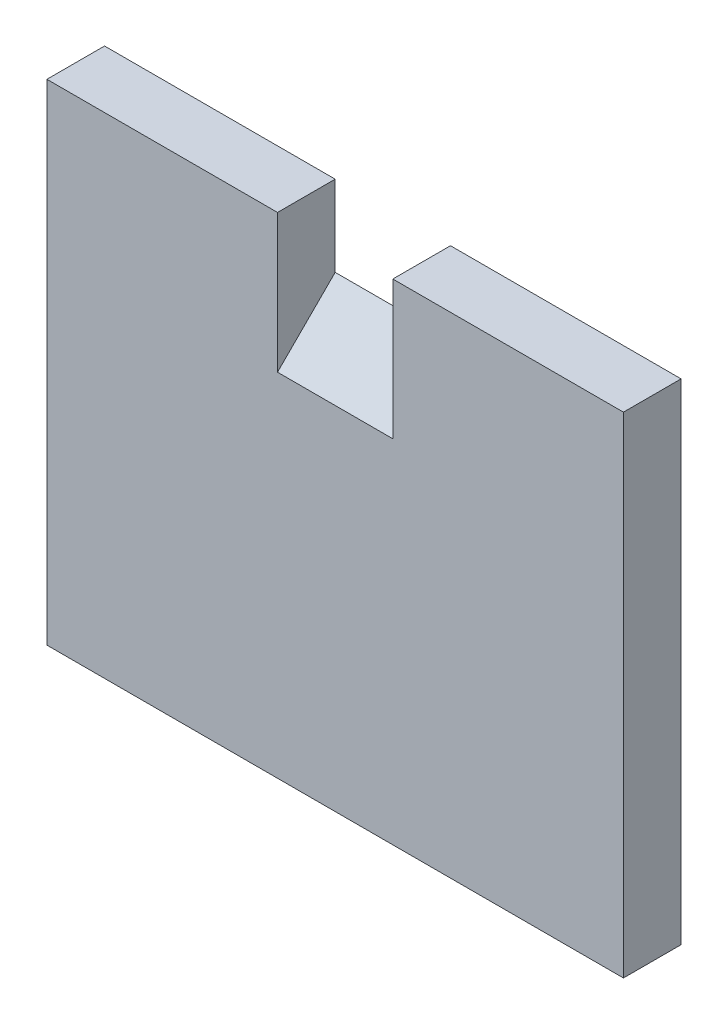
ISO-10303-21;
HEADER;
FILE_DESCRIPTION(('STEP AP214'),'2;1');
FILE_NAME('part.step','',(''),(''),'','','');
FILE_SCHEMA(('AUTOMOTIVE_DESIGN { 1 0 10303 214 1 1 1 1 }'));
ENDSEC;
DATA;
#1=APPLICATION_CONTEXT('core data for automotive mechanical design processes');
#2=APPLICATION_PROTOCOL_DEFINITION('international standard','automotive_design',2000,#1);
#3=PRODUCT_CONTEXT('',#1,'mechanical');
#4=PRODUCT('Part','Part','',(#3));
#5=PRODUCT_RELATED_PRODUCT_CATEGORY('part','',(#4));
#6=PRODUCT_DEFINITION_FORMATION('','',#4);
#7=PRODUCT_DEFINITION_CONTEXT('part definition',#1,'design');
#8=PRODUCT_DEFINITION('design','',#6,#7);
#9=PRODUCT_DEFINITION_SHAPE('','',#8);
#10=(LENGTH_UNIT() NAMED_UNIT(*) SI_UNIT(.MILLI.,.METRE.));
#11=(NAMED_UNIT(*) PLANE_ANGLE_UNIT() SI_UNIT($,.RADIAN.));
#12=(NAMED_UNIT(*) SI_UNIT($,.STERADIAN.) SOLID_ANGLE_UNIT());
#13=UNCERTAINTY_MEASURE_WITH_UNIT(LENGTH_MEASURE(1.E-05),#10,'distance_accuracy_value','');
#14=(GEOMETRIC_REPRESENTATION_CONTEXT(3) GLOBAL_UNCERTAINTY_ASSIGNED_CONTEXT((#13)) GLOBAL_UNIT_ASSIGNED_CONTEXT((#10,
#11,#12)) REPRESENTATION_CONTEXT('',''));
#15=CARTESIAN_POINT('',(0.,0.,0.));
#16=DIRECTION('',(0.,0.,1.));
#17=DIRECTION('',(1.,0.,0.));
#18=AXIS2_PLACEMENT_3D('',#15,#16,#17);
#19=CARTESIAN_POINT('',(-50.,-42.5,10.));
#20=DIRECTION('',(-1.,0.,0.));
#21=DIRECTION('',(0.,0.,1.));
#22=AXIS2_PLACEMENT_3D('',#19,#20,#21);
#23=PLANE('',#22);
#24=DIRECTION('',(0.,1.,0.));
#25=VECTOR('',#24,1.);
#26=CARTESIAN_POINT('',(-50.,-42.5,0.));
#27=LINE('',#26,#25);
#28=CARTESIAN_POINT('',(-50.,-42.5,0.));
#29=VERTEX_POINT('',#28);
#30=CARTESIAN_POINT('',(-50.,42.5,0.));
#31=VERTEX_POINT('',#30);
#32=EDGE_CURVE('E149',#29,#31,#27,.T.);
#33=ORIENTED_EDGE('',*,*,#32,.F.);
#34=DIRECTION('',(0.,0.,-1.));
#35=VECTOR('',#34,1.);
#36=CARTESIAN_POINT('',(-50.,-42.5,10.));
#37=LINE('',#36,#35);
#38=CARTESIAN_POINT('',(-50.,-42.5,10.));
#39=VERTEX_POINT('',#38);
#40=EDGE_CURVE('E147',#39,#29,#37,.T.);
#41=ORIENTED_EDGE('',*,*,#40,.F.);
#42=DIRECTION('',(0.,1.,0.));
#43=VECTOR('',#42,1.);
#44=CARTESIAN_POINT('',(-50.,-42.5,10.));
#45=LINE('',#44,#43);
#46=CARTESIAN_POINT('',(-50.,42.5,10.));
#47=VERTEX_POINT('',#46);
#48=EDGE_CURVE('E143',#39,#47,#45,.T.);
#49=ORIENTED_EDGE('',*,*,#48,.T.);
#50=DIRECTION('',(0.,0.,-1.));
#51=VECTOR('',#50,1.);
#52=CARTESIAN_POINT('',(-50.,42.5,10.));
#53=LINE('',#52,#51);
#54=EDGE_CURVE('E140',#47,#31,#53,.T.);
#55=ORIENTED_EDGE('',*,*,#54,.T.);
#56=EDGE_LOOP('',(#33,#41,#49,#55));
#57=FACE_BOUND('',#56,.T.);
#58=ADVANCED_FACE('F35',(#57),#23,.T.);
#59=CARTESIAN_POINT('',(-50.,-42.5,10.));
#60=DIRECTION('',(0.,1.,0.));
#61=DIRECTION('',(0.,0.,1.));
#62=AXIS2_PLACEMENT_3D('',#59,#60,#61);
#63=PLANE('',#62);
#64=DIRECTION('',(1.,0.,0.));
#65=VECTOR('',#64,1.);
#66=CARTESIAN_POINT('',(-50.,-42.5,0.));
#67=LINE('',#66,#65);
#68=CARTESIAN_POINT('',(50.,-42.5,0.));
#69=VERTEX_POINT('',#68);
#70=EDGE_CURVE('E142',#29,#69,#67,.T.);
#71=ORIENTED_EDGE('',*,*,#70,.T.);
#72=DIRECTION('',(0.,0.,-1.));
#73=VECTOR('',#72,1.);
#74=CARTESIAN_POINT('',(50.,-42.5,10.));
#75=LINE('',#74,#73);
#76=CARTESIAN_POINT('',(50.,-42.5,10.));
#77=VERTEX_POINT('',#76);
#78=EDGE_CURVE('E144',#77,#69,#75,.T.);
#79=ORIENTED_EDGE('',*,*,#78,.F.);
#80=DIRECTION('',(1.,0.,0.));
#81=VECTOR('',#80,1.);
#82=CARTESIAN_POINT('',(-50.,-42.5,10.));
#83=LINE('',#82,#81);
#84=EDGE_CURVE('E104',#39,#77,#83,.T.);
#85=ORIENTED_EDGE('',*,*,#84,.F.);
#86=ORIENTED_EDGE('',*,*,#40,.T.);
#87=EDGE_LOOP('',(#71,#79,#85,#86));
#88=FACE_BOUND('',#87,.T.);
#89=ADVANCED_FACE('F181',(#88),#63,.F.);
#90=CARTESIAN_POINT('',(-50.,42.5,10.));
#91=DIRECTION('',(0.,1.,0.));
#92=DIRECTION('',(0.,0.,1.));
#93=AXIS2_PLACEMENT_3D('',#90,#91,#92);
#94=PLANE('',#93);
#95=DIRECTION('',(0.,0.,1.));
#96=VECTOR('',#95,1.);
#97=CARTESIAN_POINT('',(-9.99999999999998,42.5,10.));
#98=LINE('',#97,#96);
#99=CARTESIAN_POINT('',(-9.99999999999998,42.5,0.));
#100=VERTEX_POINT('',#99);
#101=CARTESIAN_POINT('',(-9.99999999999998,42.5,10.));
#102=VERTEX_POINT('',#101);
#103=EDGE_CURVE('E11',#100,#102,#98,.T.);
#104=ORIENTED_EDGE('',*,*,#103,.F.);
#105=DIRECTION('',(1.,0.,0.));
#106=VECTOR('',#105,1.);
#107=CARTESIAN_POINT('',(-50.,42.5,0.));
#108=LINE('',#107,#106);
#109=EDGE_CURVE('E151',#31,#100,#108,.T.);
#110=ORIENTED_EDGE('',*,*,#109,.F.);
#111=ORIENTED_EDGE('',*,*,#54,.F.);
#112=DIRECTION('',(1.,0.,0.));
#113=VECTOR('',#112,1.);
#114=CARTESIAN_POINT('',(-50.,42.5,10.));
#115=LINE('',#114,#113);
#116=EDGE_CURVE('E146',#47,#102,#115,.T.);
#117=ORIENTED_EDGE('',*,*,#116,.T.);
#118=EDGE_LOOP('',(#104,#110,#111,#117));
#119=FACE_BOUND('',#118,.T.);
#120=ADVANCED_FACE('F176',(#119),#94,.T.);
#121=CARTESIAN_POINT('',(-9.99999999999998,0.,0.));
#122=DIRECTION('',(-1.,0.,0.));
#123=DIRECTION('',(0.,0.,1.));
#124=AXIS2_PLACEMENT_3D('',#121,#122,#123);
#125=PLANE('',#124);
#126=DIRECTION('',(0.,-1.,0.));
#127=VECTOR('',#126,1.);
#128=CARTESIAN_POINT('',(-9.99999999999998,28.5,10.));
#129=LINE('',#128,#127);
#130=CARTESIAN_POINT('',(-9.99999999999998,18.5000000000001,10.));
#131=VERTEX_POINT('',#130);
#132=EDGE_CURVE('E154',#102,#131,#129,.T.);
#133=ORIENTED_EDGE('',*,*,#132,.T.);
#134=DIRECTION('',(0.,-0.707106781186544,0.707106781186551));
#135=VECTOR('',#134,1.);
#136=CARTESIAN_POINT('',(-9.99999999999998,28.5,0.));
#137=LINE('',#136,#135);
#138=CARTESIAN_POINT('',(-9.99999999999998,28.5,0.));
#139=VERTEX_POINT('',#138);
#140=EDGE_CURVE('E131',#139,#131,#137,.T.);
#141=ORIENTED_EDGE('',*,*,#140,.F.);
#142=DIRECTION('',(0.,1.,0.));
#143=VECTOR('',#142,1.);
#144=CARTESIAN_POINT('',(-9.99999999999998,42.5,0.));
#145=LINE('',#144,#143);
#146=EDGE_CURVE('E45',#139,#100,#145,.T.);
#147=ORIENTED_EDGE('',*,*,#146,.T.);
#148=ORIENTED_EDGE('',*,*,#103,.T.);
#149=EDGE_LOOP('',(#133,#141,#147,#148));
#150=FACE_BOUND('',#149,.T.);
#151=ADVANCED_FACE('F163',(#150),#125,.F.);
#152=CARTESIAN_POINT('',(0.,0.,0.));
#153=DIRECTION('',(0.,0.,-1.));
#154=DIRECTION('',(-1.,0.,0.));
#155=AXIS2_PLACEMENT_3D('',#152,#153,#154);
#156=PLANE('',#155);
#157=DIRECTION('',(1.,0.,0.));
#158=VECTOR('',#157,1.);
#159=CARTESIAN_POINT('',(-9.99999999999998,28.5,0.));
#160=LINE('',#159,#158);
#161=CARTESIAN_POINT('',(10.,28.5,0.));
#162=VERTEX_POINT('',#161);
#163=EDGE_CURVE('E137',#139,#162,#160,.T.);
#164=ORIENTED_EDGE('',*,*,#163,.T.);
#165=DIRECTION('',(0.,1.,0.));
#166=VECTOR('',#165,1.);
#167=CARTESIAN_POINT('',(10.,28.5,0.));
#168=LINE('',#167,#166);
#169=CARTESIAN_POINT('',(10.,42.5,0.));
#170=VERTEX_POINT('',#169);
#171=EDGE_CURVE('E121',#162,#170,#168,.T.);
#172=ORIENTED_EDGE('',*,*,#171,.T.);
#173=DIRECTION('',(1.,0.,0.));
#174=VECTOR('',#173,1.);
#175=CARTESIAN_POINT('',(10.,42.5,0.));
#176=LINE('',#175,#174);
#177=CARTESIAN_POINT('',(50.,42.5,0.));
#178=VERTEX_POINT('',#177);
#179=EDGE_CURVE('E123',#170,#178,#176,.T.);
#180=ORIENTED_EDGE('',*,*,#179,.T.);
#181=DIRECTION('',(0.,1.,0.));
#182=VECTOR('',#181,1.);
#183=CARTESIAN_POINT('',(50.,-42.5,0.));
#184=LINE('',#183,#182);
#185=EDGE_CURVE('E39',#69,#178,#184,.T.);
#186=ORIENTED_EDGE('',*,*,#185,.F.);
#187=ORIENTED_EDGE('',*,*,#70,.F.);
#188=ORIENTED_EDGE('',*,*,#32,.T.);
#189=ORIENTED_EDGE('',*,*,#109,.T.);
#190=ORIENTED_EDGE('',*,*,#146,.F.);
#191=EDGE_LOOP('',(#164,#172,#180,#186,#187,#188,#189,#190));
#192=FACE_BOUND('',#191,.T.);
#193=ADVANCED_FACE('F173',(#192),#156,.T.);
#194=CARTESIAN_POINT('',(50.,-42.5,10.));
#195=DIRECTION('',(-1.,0.,0.));
#196=DIRECTION('',(0.,0.,1.));
#197=AXIS2_PLACEMENT_3D('',#194,#195,#196);
#198=PLANE('',#197);
#199=ORIENTED_EDGE('',*,*,#185,.T.);
#200=DIRECTION('',(0.,0.,1.));
#201=VECTOR('',#200,1.);
#202=CARTESIAN_POINT('',(50.,42.5,0.));
#203=LINE('',#202,#201);
#204=CARTESIAN_POINT('',(50.,42.5,10.));
#205=VERTEX_POINT('',#204);
#206=EDGE_CURVE('E113',#178,#205,#203,.T.);
#207=ORIENTED_EDGE('',*,*,#206,.T.);
#208=DIRECTION('',(0.,1.,0.));
#209=VECTOR('',#208,1.);
#210=CARTESIAN_POINT('',(50.,-42.5,10.));
#211=LINE('',#210,#209);
#212=EDGE_CURVE('E96',#77,#205,#211,.T.);
#213=ORIENTED_EDGE('',*,*,#212,.F.);
#214=ORIENTED_EDGE('',*,*,#78,.T.);
#215=EDGE_LOOP('',(#199,#207,#213,#214));
#216=FACE_BOUND('',#215,.T.);
#217=ADVANCED_FACE('F118',(#216),#198,.F.);
#218=CARTESIAN_POINT('',(0.,0.,10.));
#219=DIRECTION('',(0.,0.,-1.));
#220=DIRECTION('',(-1.,0.,0.));
#221=AXIS2_PLACEMENT_3D('',#218,#219,#220);
#222=PLANE('',#221);
#223=DIRECTION('',(1.,0.,0.));
#224=VECTOR('',#223,1.);
#225=CARTESIAN_POINT('',(-9.99999999999998,18.5000000000001,10.));
#226=LINE('',#225,#224);
#227=CARTESIAN_POINT('',(10.,18.5000000000001,10.));
#228=VERTEX_POINT('',#227);
#229=EDGE_CURVE('E134',#131,#228,#226,.T.);
#230=ORIENTED_EDGE('',*,*,#229,.F.);
#231=ORIENTED_EDGE('',*,*,#132,.F.);
#232=ORIENTED_EDGE('',*,*,#116,.F.);
#233=ORIENTED_EDGE('',*,*,#48,.F.);
#234=ORIENTED_EDGE('',*,*,#84,.T.);
#235=ORIENTED_EDGE('',*,*,#212,.T.);
#236=DIRECTION('',(1.,0.,0.));
#237=VECTOR('',#236,1.);
#238=CARTESIAN_POINT('',(10.,42.5,10.));
#239=LINE('',#238,#237);
#240=CARTESIAN_POINT('',(10.,42.5,10.));
#241=VERTEX_POINT('',#240);
#242=EDGE_CURVE('E100',#241,#205,#239,.T.);
#243=ORIENTED_EDGE('',*,*,#242,.F.);
#244=DIRECTION('',(0.,-1.,0.));
#245=VECTOR('',#244,1.);
#246=CARTESIAN_POINT('',(10.,18.5000000000001,10.));
#247=LINE('',#246,#245);
#248=EDGE_CURVE('E116',#241,#228,#247,.T.);
#249=ORIENTED_EDGE('',*,*,#248,.T.);
#250=EDGE_LOOP('',(#230,#231,#232,#233,#234,#235,#243,#249));
#251=FACE_BOUND('',#250,.T.);
#252=ADVANCED_FACE('F37',(#251),#222,.F.);
#253=CARTESIAN_POINT('',(-9.99999999999998,28.5,0.));
#254=DIRECTION('',(0.,0.707106781186551,0.707106781186544));
#255=DIRECTION('',(0.,-0.707106781186544,0.707106781186551));
#256=AXIS2_PLACEMENT_3D('',#253,#254,#255);
#257=PLANE('',#256);
#258=DIRECTION('',(0.,0.707106781186544,-0.707106781186551));
#259=VECTOR('',#258,1.);
#260=CARTESIAN_POINT('',(10.,28.5,0.));
#261=LINE('',#260,#259);
#262=EDGE_CURVE('E129',#228,#162,#261,.T.);
#263=ORIENTED_EDGE('',*,*,#262,.T.);
#264=ORIENTED_EDGE('',*,*,#163,.F.);
#265=ORIENTED_EDGE('',*,*,#140,.T.);
#266=ORIENTED_EDGE('',*,*,#229,.T.);
#267=EDGE_LOOP('',(#263,#264,#265,#266));
#268=FACE_BOUND('',#267,.T.);
#269=ADVANCED_FACE('F167',(#268),#257,.T.);
#270=CARTESIAN_POINT('',(10.,0.,0.));
#271=DIRECTION('',(-1.,0.,0.));
#272=DIRECTION('',(0.,0.,1.));
#273=AXIS2_PLACEMENT_3D('',#270,#271,#272);
#274=PLANE('',#273);
#275=ORIENTED_EDGE('',*,*,#248,.F.);
#276=DIRECTION('',(0.,0.,1.));
#277=VECTOR('',#276,1.);
#278=CARTESIAN_POINT('',(10.,42.5,0.));
#279=LINE('',#278,#277);
#280=EDGE_CURVE('E115',#170,#241,#279,.T.);
#281=ORIENTED_EDGE('',*,*,#280,.F.);
#282=ORIENTED_EDGE('',*,*,#171,.F.);
#283=ORIENTED_EDGE('',*,*,#262,.F.);
#284=EDGE_LOOP('',(#275,#281,#282,#283));
#285=FACE_BOUND('',#284,.T.);
#286=ADVANCED_FACE('F170',(#285),#274,.T.);
#287=CARTESIAN_POINT('',(10.,42.5,0.));
#288=DIRECTION('',(0.,1.,0.));
#289=DIRECTION('',(0.,0.,1.));
#290=AXIS2_PLACEMENT_3D('',#287,#288,#289);
#291=PLANE('',#290);
#292=ORIENTED_EDGE('',*,*,#206,.F.);
#293=ORIENTED_EDGE('',*,*,#179,.F.);
#294=ORIENTED_EDGE('',*,*,#280,.T.);
#295=ORIENTED_EDGE('',*,*,#242,.T.);
#296=EDGE_LOOP('',(#292,#293,#294,#295));
#297=FACE_BOUND('',#296,.T.);
#298=ADVANCED_FACE('F111',(#297),#291,.T.);
#299=CLOSED_SHELL('',(#58,#89,#120,#151,#193,#217,#252,#269,#286,#298));
#300=MANIFOLD_SOLID_BREP('B2',#299);
#301=ADVANCED_BREP_SHAPE_REPRESENTATION('',(#18,#300),#14);
#302=SHAPE_DEFINITION_REPRESENTATION(#9,#301);
ENDSEC;
END-ISO-10303-21;
